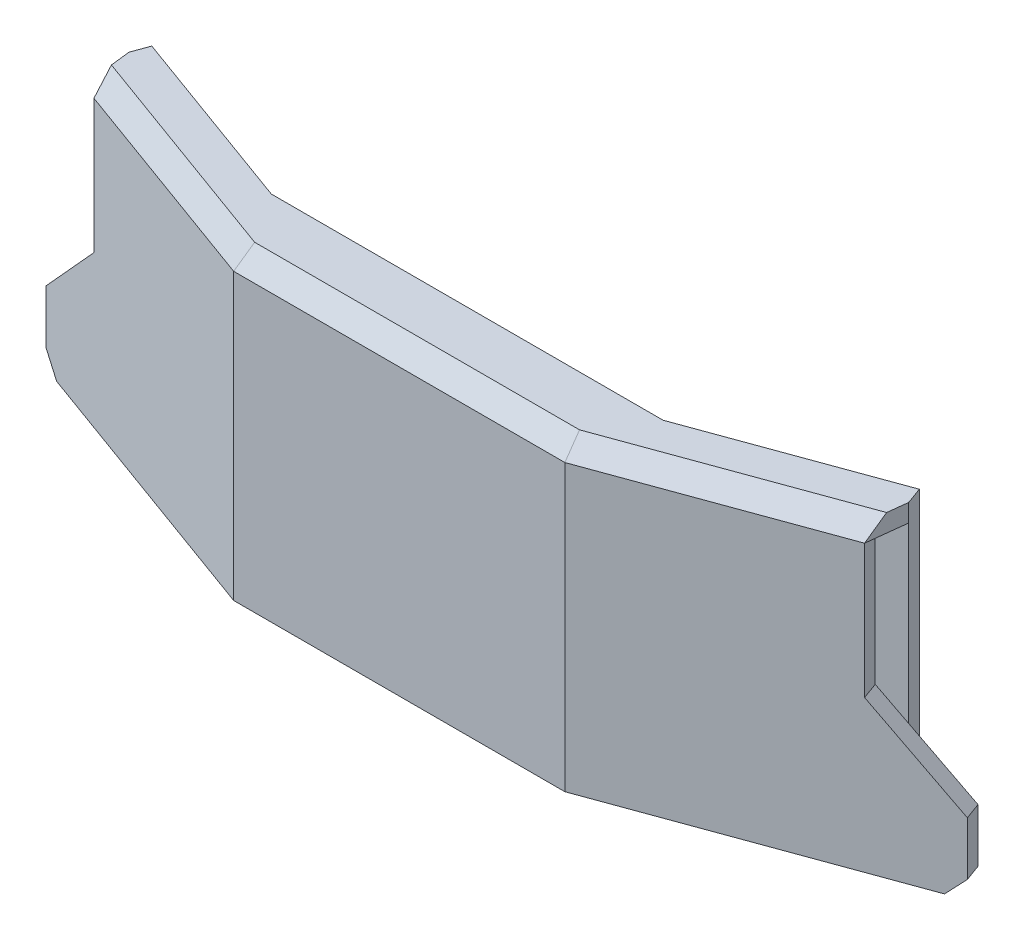
ISO-10303-21;
HEADER;
FILE_DESCRIPTION(('STEP AP214'),'2;1');
FILE_NAME('part.step','',(''),(''),'','','');
FILE_SCHEMA(('AUTOMOTIVE_DESIGN { 1 0 10303 214 1 1 1 1 }'));
ENDSEC;
DATA;
#1=APPLICATION_CONTEXT('core data for automotive mechanical design processes');
#2=APPLICATION_PROTOCOL_DEFINITION('international standard','automotive_design',2000,#1);
#3=PRODUCT_CONTEXT('',#1,'mechanical');
#4=PRODUCT('Part','Part','',(#3));
#5=PRODUCT_RELATED_PRODUCT_CATEGORY('part','',(#4));
#6=PRODUCT_DEFINITION_FORMATION('','',#4);
#7=PRODUCT_DEFINITION_CONTEXT('part definition',#1,'design');
#8=PRODUCT_DEFINITION('design','',#6,#7);
#9=PRODUCT_DEFINITION_SHAPE('','',#8);
#10=(LENGTH_UNIT() NAMED_UNIT(*) SI_UNIT(.MILLI.,.METRE.));
#11=(NAMED_UNIT(*) PLANE_ANGLE_UNIT() SI_UNIT($,.RADIAN.));
#12=(NAMED_UNIT(*) SI_UNIT($,.STERADIAN.) SOLID_ANGLE_UNIT());
#13=UNCERTAINTY_MEASURE_WITH_UNIT(LENGTH_MEASURE(1.E-05),#10,'distance_accuracy_value','');
#14=(GEOMETRIC_REPRESENTATION_CONTEXT(3) GLOBAL_UNCERTAINTY_ASSIGNED_CONTEXT((#13)) GLOBAL_UNIT_ASSIGNED_CONTEXT((#10,
#11,#12)) REPRESENTATION_CONTEXT('',''));
#15=CARTESIAN_POINT('',(0.,0.,0.));
#16=DIRECTION('',(0.,0.,1.));
#17=DIRECTION('',(1.,0.,0.));
#18=AXIS2_PLACEMENT_3D('',#15,#16,#17);
#19=CARTESIAN_POINT('',(0.,0.,0.));
#20=DIRECTION('',(0.,-1.,0.));
#21=DIRECTION('',(0.,0.,-1.));
#22=AXIS2_PLACEMENT_3D('',#19,#20,#21);
#23=PLANE('',#22);
#24=DIRECTION('',(0.939692620785973,0.,-0.342020143325491));
#25=VECTOR('',#24,1.);
#26=CARTESIAN_POINT('',(18.233058655028,0.,0.));
#27=LINE('',#26,#25);
#28=CARTESIAN_POINT('',(37.4365744717796,0.,-6.98950815055367));
#29=VERTEX_POINT('',#28);
#30=CARTESIAN_POINT('',(40.6840402866537,0.,-8.17148904396418));
#31=VERTEX_POINT('',#30);
#32=EDGE_CURVE('E306',#29,#31,#27,.T.);
#33=ORIENTED_EDGE('',*,*,#32,.F.);
#34=DIRECTION('',(0.,0.,1.));
#35=VECTOR('',#34,1.);
#36=CARTESIAN_POINT('',(37.4365744717795,0.,-11.2462192404578));
#37=LINE('',#36,#35);
#38=CARTESIAN_POINT('',(37.4365744717795,0.,-11.2462192404578));
#39=VERTEX_POINT('',#38);
#40=EDGE_CURVE('E408',#39,#29,#37,.T.);
#41=ORIENTED_EDGE('',*,*,#40,.F.);
#42=DIRECTION('',(-0.939692620785974,0.,0.342020143325488));
#43=VECTOR('',#42,1.);
#44=CARTESIAN_POINT('',(43.0747301964954,0.,-13.2983401004107));
#45=LINE('',#44,#43);
#46=CARTESIAN_POINT('',(43.0747301964954,0.,-13.2983401004107));
#47=VERTEX_POINT('',#46);
#48=EDGE_CURVE('E406',#47,#39,#45,.T.);
#49=ORIENTED_EDGE('',*,*,#48,.F.);
#50=DIRECTION('',(-0.342020143325483,0.,-0.939692620785976));
#51=VECTOR('',#50,1.);
#52=CARTESIAN_POINT('',(43.7587704831463,0.,-11.4189548588388));
#53=LINE('',#52,#51);
#54=CARTESIAN_POINT('',(43.7587704831463,0.,-11.4189548588388));
#55=VERTEX_POINT('',#54);
#56=EDGE_CURVE('E404',#55,#47,#53,.T.);
#57=ORIENTED_EDGE('',*,*,#56,.F.);
#58=DIRECTION('',(0.939692620785975,0.,-0.342020143325486));
#59=VECTOR('',#58,1.);
#60=CARTESIAN_POINT('',(40.0000000000024,0.,-10.0508742855368));
#61=LINE('',#60,#59);
#62=CARTESIAN_POINT('',(40.0000000000024,0.,-10.0508742855368));
#63=VERTEX_POINT('',#62);
#64=EDGE_CURVE('E402',#63,#55,#61,.T.);
#65=ORIENTED_EDGE('',*,*,#64,.F.);
#66=DIRECTION('',(-0.342020143325488,0.,-0.939692620785974));
#67=VECTOR('',#66,1.);
#68=CARTESIAN_POINT('',(40.0000000000024,0.,-10.0508742855368));
#69=LINE('',#68,#67);
#70=EDGE_CURVE('E400',#31,#63,#69,.T.);
#71=ORIENTED_EDGE('',*,*,#70,.F.);
#72=EDGE_LOOP('',(#33,#41,#49,#57,#65,#71));
#73=FACE_BOUND('',#72,.T.);
#74=ADVANCED_FACE('F46',(#73),#23,.T.);
#75=CARTESIAN_POINT('',(-40.0000000000015,30.,-10.0508742855391));
#76=DIRECTION('',(0.342020143325618,0.,-0.939692620785927));
#77=DIRECTION('',(-0.939692620785927,0.,-0.342020143325618));
#78=AXIS2_PLACEMENT_3D('',#75,#76,#77);
#79=PLANE('',#78);
#80=DIRECTION('',(0.939692620785927,0.,0.342020143325618));
#81=VECTOR('',#80,1.);
#82=CARTESIAN_POINT('',(-40.0000000000015,0.,-10.0508742855391));
#83=LINE('',#82,#81);
#84=CARTESIAN_POINT('',(-43.7587704831452,0.,-11.4189548588416));
#85=VERTEX_POINT('',#84);
#86=CARTESIAN_POINT('',(-40.0000000000015,0.,-10.0508742855391));
#87=VERTEX_POINT('',#86);
#88=EDGE_CURVE('E353',#85,#87,#83,.T.);
#89=ORIENTED_EDGE('',*,*,#88,.T.);
#90=DIRECTION('',(0.,-1.,0.));
#91=VECTOR('',#90,1.);
#92=CARTESIAN_POINT('',(-40.0000000000015,30.,-10.0508742855391));
#93=LINE('',#92,#91);
#94=CARTESIAN_POINT('',(-40.0000000000015,30.,-10.0508742855391));
#95=VERTEX_POINT('',#94);
#96=EDGE_CURVE('E307',#95,#87,#93,.T.);
#97=ORIENTED_EDGE('',*,*,#96,.F.);
#98=DIRECTION('',(0.939692620785927,0.,0.342020143325618));
#99=VECTOR('',#98,1.);
#100=CARTESIAN_POINT('',(-40.0000000000015,30.,-10.0508742855391));
#101=LINE('',#100,#99);
#102=CARTESIAN_POINT('',(-43.7587704831452,30.,-11.4189548588416));
#103=VERTEX_POINT('',#102);
#104=EDGE_CURVE('E354',#103,#95,#101,.T.);
#105=ORIENTED_EDGE('',*,*,#104,.F.);
#106=DIRECTION('',(0.,-1.,0.));
#107=VECTOR('',#106,1.);
#108=CARTESIAN_POINT('',(-43.7587704831452,30.,-11.4189548588416));
#109=LINE('',#108,#107);
#110=EDGE_CURVE('E394',#103,#85,#109,.T.);
#111=ORIENTED_EDGE('',*,*,#110,.T.);
#112=EDGE_LOOP('',(#89,#97,#105,#111));
#113=FACE_BOUND('',#112,.T.);
#114=ADVANCED_FACE('F562',(#113),#79,.F.);
#115=CARTESIAN_POINT('',(-40.0000000000015,30.,-10.0508742855391));
#116=DIRECTION('',(0.939692620785933,0.,0.342020143325602));
#117=DIRECTION('',(0.342020143325602,0.,-0.939692620785933));
#118=AXIS2_PLACEMENT_3D('',#115,#116,#117);
#119=PLANE('',#118);
#120=DIRECTION('',(-0.342020143325602,0.,0.939692620785933));
#121=VECTOR('',#120,1.);
#122=CARTESIAN_POINT('',(-40.0000000000015,0.,-10.0508742855391));
#123=LINE('',#122,#121);
#124=CARTESIAN_POINT('',(-40.6840402866527,0.,-8.17148904396725));
#125=VERTEX_POINT('',#124);
#126=EDGE_CURVE('E397',#87,#125,#123,.T.);
#127=ORIENTED_EDGE('',*,*,#126,.T.);
#128=DIRECTION('',(0.,-1.,0.));
#129=VECTOR('',#128,1.);
#130=CARTESIAN_POINT('',(-40.6840402866527,30.,-8.17148904396725));
#131=LINE('',#130,#129);
#132=CARTESIAN_POINT('',(-40.6840402866527,30.,-8.17148904396725));
#133=VERTEX_POINT('',#132);
#134=EDGE_CURVE('E466',#133,#125,#131,.T.);
#135=ORIENTED_EDGE('',*,*,#134,.F.);
#136=DIRECTION('',(-0.342020143325602,0.,0.939692620785933));
#137=VECTOR('',#136,1.);
#138=CARTESIAN_POINT('',(-40.0000000000015,30.,-10.0508742855391));
#139=LINE('',#138,#137);
#140=EDGE_CURVE('E357',#95,#133,#139,.T.);
#141=ORIENTED_EDGE('',*,*,#140,.F.);
#142=ORIENTED_EDGE('',*,*,#96,.T.);
#143=EDGE_LOOP('',(#127,#135,#141,#142));
#144=FACE_BOUND('',#143,.T.);
#145=ADVANCED_FACE('F560',(#144),#119,.F.);
#146=CARTESIAN_POINT('',(-42.5634255282245,30.,-8.85552933061848));
#147=DIRECTION('',(0.939692620785926,0.,0.342020143325619));
#148=DIRECTION('',(0.342020143325619,0.,-0.939692620785927));
#149=AXIS2_PLACEMENT_3D('',#146,#147,#148);
#150=PLANE('',#149);
#151=DIRECTION('',(0.,-1.,0.));
#152=VECTOR('',#151,1.);
#153=CARTESIAN_POINT('',(-42.5634255282245,30.,-8.85552933061848));
#154=LINE('',#153,#152);
#155=CARTESIAN_POINT('',(-42.5634255282245,30.,-8.85552933061848));
#156=VERTEX_POINT('',#155);
#157=CARTESIAN_POINT('',(-42.5634255282245,15.,-8.85552933061852));
#158=VERTEX_POINT('',#157);
#159=EDGE_CURVE('E463',#156,#158,#154,.T.);
#160=ORIENTED_EDGE('',*,*,#159,.T.);
#161=DIRECTION('',(-0.342020143325619,0.,0.939692620785927));
#162=VECTOR('',#161,1.);
#163=CARTESIAN_POINT('',(-35.638045454857,15.,-27.8828547033399));
#164=LINE('',#163,#162);
#165=CARTESIAN_POINT('',(-43.2474658148758,15.,-6.97614408904662));
#166=VERTEX_POINT('',#165);
#167=EDGE_CURVE('E282',#158,#166,#164,.T.);
#168=ORIENTED_EDGE('',*,*,#167,.T.);
#169=DIRECTION('',(0.,-1.,0.));
#170=VECTOR('',#169,1.);
#171=CARTESIAN_POINT('',(-43.2474658148758,30.,-6.97614408904662));
#172=LINE('',#171,#170);
#173=CARTESIAN_POINT('',(-43.2474658148758,30.,-6.97614408904662));
#174=VERTEX_POINT('',#173);
#175=EDGE_CURVE('E460',#174,#166,#172,.T.);
#176=ORIENTED_EDGE('',*,*,#175,.F.);
#177=DIRECTION('',(-0.342020143325619,0.,0.939692620785926));
#178=VECTOR('',#177,1.);
#179=CARTESIAN_POINT('',(-42.5634255282245,30.,-8.85552933061848));
#180=LINE('',#179,#178);
#181=EDGE_CURVE('E364',#156,#174,#180,.T.);
#182=ORIENTED_EDGE('',*,*,#181,.F.);
#183=EDGE_LOOP('',(#160,#168,#176,#182));
#184=FACE_BOUND('',#183,.T.);
#185=ADVANCED_FACE('F554',(#184),#150,.F.);
#186=CARTESIAN_POINT('',(-43.2474658148758,30.,-6.97614408904662));
#187=DIRECTION('',(0.342020143325619,0.,-0.939692620785927));
#188=DIRECTION('',(-0.939692620785927,0.,-0.342020143325619));
#189=AXIS2_PLACEMENT_3D('',#186,#187,#188);
#190=PLANE('',#189);
#191=DIRECTION('',(0.,-1.,0.));
#192=VECTOR('',#191,1.);
#193=CARTESIAN_POINT('',(-51.7046994019491,5.99999999999991,-10.0543253789772));
#194=LINE('',#193,#192);
#195=CARTESIAN_POINT('',(-51.7046994019491,5.99999999999991,-10.0543253789772));
#196=VERTEX_POINT('',#195);
#197=CARTESIAN_POINT('',(-51.7046994019492,0.,-10.0543253789772));
#198=VERTEX_POINT('',#197);
#199=EDGE_CURVE('E279',#196,#198,#194,.T.);
#200=ORIENTED_EDGE('',*,*,#199,.T.);
#201=DIRECTION('',(-0.664463024388691,0.707106781186544,-0.241844762647941));
#202=VECTOR('',#201,1.);
#203=CARTESIAN_POINT('',(-51.7046994019492,0.,-10.0543253789772));
#204=LINE('',#203,#202);
#205=CARTESIAN_POINT('',(-49.8253141603773,-2.,-9.37028509232598));
#206=VERTEX_POINT('',#205);
#207=EDGE_CURVE('E494',#198,#206,#204,.F.);
#208=ORIENTED_EDGE('',*,*,#207,.T.);
#209=DIRECTION('',(-0.939692620785927,0.,-0.342020143325619));
#210=VECTOR('',#209,1.);
#211=CARTESIAN_POINT('',(-18.5857126164448,-2.,2.00000000000009));
#212=LINE('',#211,#210);
#213=CARTESIAN_POINT('',(-18.5857126164448,-2.,2.00000000000009));
#214=VERTEX_POINT('',#213);
#215=EDGE_CURVE('E286',#214,#206,#212,.T.);
#216=ORIENTED_EDGE('',*,*,#215,.F.);
#217=DIRECTION('',(0.,-1.,0.));
#218=VECTOR('',#217,1.);
#219=CARTESIAN_POINT('',(-18.5857126164448,30.,2.00000000000009));
#220=LINE('',#219,#218);
#221=CARTESIAN_POINT('',(-18.5857126164448,30.,2.00000000000009));
#222=VERTEX_POINT('',#221);
#223=EDGE_CURVE('E458',#222,#214,#220,.T.);
#224=ORIENTED_EDGE('',*,*,#223,.F.);
#225=DIRECTION('',(-0.939692620785927,0.,-0.342020143325619));
#226=VECTOR('',#225,1.);
#227=CARTESIAN_POINT('',(-43.2474658148758,30.,-6.97614408904662));
#228=LINE('',#227,#226);
#229=EDGE_CURVE('E483',#222,#174,#228,.T.);
#230=ORIENTED_EDGE('',*,*,#229,.T.);
#231=ORIENTED_EDGE('',*,*,#175,.T.);
#232=DIRECTION('',(-0.664463024388684,-0.707106781186551,-0.241844762647939));
#233=VECTOR('',#232,1.);
#234=CARTESIAN_POINT('',(-43.2474658148758,15.,-6.97614408904662));
#235=LINE('',#234,#233);
#236=EDGE_CURVE('E270',#166,#196,#235,.T.);
#237=ORIENTED_EDGE('',*,*,#236,.T.);
#238=EDGE_LOOP('',(#200,#208,#216,#224,#230,#231,#237));
#239=FACE_BOUND('',#238,.T.);
#240=ADVANCED_FACE('F519',(#239),#190,.F.);
#241=CARTESIAN_POINT('',(-18.5857126164448,30.,2.00000000000009));
#242=DIRECTION('',(0.,0.,-1.));
#243=DIRECTION('',(-1.,0.,0.));
#244=AXIS2_PLACEMENT_3D('',#241,#242,#243);
#245=PLANE('',#244);
#246=DIRECTION('',(0.,-1.,0.));
#247=VECTOR('',#246,1.);
#248=CARTESIAN_POINT('',(18.5857126164443,30.,2.00000000000003));
#249=LINE('',#248,#247);
#250=CARTESIAN_POINT('',(18.5857126164443,30.,2.00000000000003));
#251=VERTEX_POINT('',#250);
#252=CARTESIAN_POINT('',(18.5857126164443,-2.,2.00000000000003));
#253=VERTEX_POINT('',#252);
#254=EDGE_CURVE('E455',#251,#253,#249,.T.);
#255=ORIENTED_EDGE('',*,*,#254,.F.);
#256=DIRECTION('',(-1.,0.,0.));
#257=VECTOR('',#256,1.);
#258=CARTESIAN_POINT('',(-18.5857126164448,30.,2.00000000000009));
#259=LINE('',#258,#257);
#260=EDGE_CURVE('E481',#251,#222,#259,.T.);
#261=ORIENTED_EDGE('',*,*,#260,.T.);
#262=ORIENTED_EDGE('',*,*,#223,.T.);
#263=DIRECTION('',(-1.,0.,0.));
#264=VECTOR('',#263,1.);
#265=CARTESIAN_POINT('',(18.5857126164443,-2.,2.00000000000003));
#266=LINE('',#265,#264);
#267=EDGE_CURVE('E300',#253,#214,#266,.T.);
#268=ORIENTED_EDGE('',*,*,#267,.F.);
#269=EDGE_LOOP('',(#255,#261,#262,#268));
#270=FACE_BOUND('',#269,.T.);
#271=ADVANCED_FACE('F526',(#270),#245,.F.);
#272=CARTESIAN_POINT('',(43.2474658148765,30.,-6.97614408904317));
#273=DIRECTION('',(-0.342020143325486,0.,-0.939692620785975));
#274=DIRECTION('',(-0.939692620785975,0.,0.342020143325486));
#275=AXIS2_PLACEMENT_3D('',#272,#273,#274);
#276=PLANE('',#275);
#277=DIRECTION('',(-0.939692620785975,0.,0.342020143325486));
#278=VECTOR('',#277,1.);
#279=CARTESIAN_POINT('',(43.2474658148765,-2.,-6.97614408904317));
#280=LINE('',#279,#278);
#281=CARTESIAN_POINT('',(49.8253141603785,-2.,-9.37028509232163));
#282=VERTEX_POINT('',#281);
#283=EDGE_CURVE('E298',#282,#253,#280,.T.);
#284=ORIENTED_EDGE('',*,*,#283,.F.);
#285=DIRECTION('',(-0.664463024388721,-0.707106781186548,0.241844762647846));
#286=VECTOR('',#285,1.);
#287=CARTESIAN_POINT('',(49.8253141603785,-2.,-9.37028509232163));
#288=LINE('',#287,#286);
#289=CARTESIAN_POINT('',(51.7046994019503,-1.22298005056365E-13,-10.0543253789726));
#290=VERTEX_POINT('',#289);
#291=EDGE_CURVE('E69',#282,#290,#288,.F.);
#292=ORIENTED_EDGE('',*,*,#291,.T.);
#293=DIRECTION('',(0.,1.,0.));
#294=VECTOR('',#293,1.);
#295=CARTESIAN_POINT('',(51.7046994019503,5.9999999999999,-10.0543253789726));
#296=LINE('',#295,#294);
#297=CARTESIAN_POINT('',(51.7046994019503,5.9999999999999,-10.0543253789726));
#298=VERTEX_POINT('',#297);
#299=EDGE_CURVE('E247',#290,#298,#296,.T.);
#300=ORIENTED_EDGE('',*,*,#299,.T.);
#301=DIRECTION('',(-0.664463024388719,0.707106781186551,0.241844762647845));
#302=VECTOR('',#301,1.);
#303=CARTESIAN_POINT('',(43.2474658148765,15.,-6.97614408904318));
#304=LINE('',#303,#302);
#305=CARTESIAN_POINT('',(43.2474658148765,15.,-6.97614408904318));
#306=VERTEX_POINT('',#305);
#307=EDGE_CURVE('E252',#298,#306,#304,.T.);
#308=ORIENTED_EDGE('',*,*,#307,.T.);
#309=DIRECTION('',(0.,-1.,0.));
#310=VECTOR('',#309,1.);
#311=CARTESIAN_POINT('',(43.2474658148765,30.,-6.97614408904317));
#312=LINE('',#311,#310);
#313=CARTESIAN_POINT('',(43.2474658148765,30.,-6.97614408904317));
#314=VERTEX_POINT('',#313);
#315=EDGE_CURVE('E453',#314,#306,#312,.T.);
#316=ORIENTED_EDGE('',*,*,#315,.F.);
#317=DIRECTION('',(-0.939692620785975,0.,0.342020143325486));
#318=VECTOR('',#317,1.);
#319=CARTESIAN_POINT('',(18.5857126164443,30.,2.00000000000003));
#320=LINE('',#319,#318);
#321=EDGE_CURVE('E479',#314,#251,#320,.T.);
#322=ORIENTED_EDGE('',*,*,#321,.T.);
#323=ORIENTED_EDGE('',*,*,#254,.T.);
#324=EDGE_LOOP('',(#284,#292,#300,#308,#316,#322,#323));
#325=FACE_BOUND('',#324,.T.);
#326=ADVANCED_FACE('F249',(#325),#276,.F.);
#327=CARTESIAN_POINT('',(42.5634255282255,30.,-8.85552933061514));
#328=DIRECTION('',(-0.939692620785975,0.,0.342020143325486));
#329=DIRECTION('',(0.342020143325486,0.,0.939692620785975));
#330=AXIS2_PLACEMENT_3D('',#327,#328,#329);
#331=PLANE('',#330);
#332=ORIENTED_EDGE('',*,*,#315,.T.);
#333=DIRECTION('',(0.342020143325486,0.,0.939692620785975));
#334=VECTOR('',#333,1.);
#335=CARTESIAN_POINT('',(35.6380454548608,15.,-27.8828547033374));
#336=LINE('',#335,#334);
#337=CARTESIAN_POINT('',(42.5634255282256,15.,-8.85552933061496));
#338=VERTEX_POINT('',#337);
#339=EDGE_CURVE('E260',#338,#306,#336,.T.);
#340=ORIENTED_EDGE('',*,*,#339,.F.);
#341=DIRECTION('',(0.,-1.,0.));
#342=VECTOR('',#341,1.);
#343=CARTESIAN_POINT('',(42.5634255282255,30.,-8.85552933061514));
#344=LINE('',#343,#342);
#345=CARTESIAN_POINT('',(42.5634255282255,30.,-8.85552933061514));
#346=VERTEX_POINT('',#345);
#347=EDGE_CURVE('E450',#346,#338,#344,.T.);
#348=ORIENTED_EDGE('',*,*,#347,.F.);
#349=DIRECTION('',(-0.342020143325486,0.,-0.939692620785975));
#350=VECTOR('',#349,1.);
#351=CARTESIAN_POINT('',(42.5634255282255,30.,-8.85552933061514));
#352=LINE('',#351,#350);
#353=EDGE_CURVE('E367',#314,#346,#352,.T.);
#354=ORIENTED_EDGE('',*,*,#353,.F.);
#355=EDGE_LOOP('',(#332,#340,#348,#354));
#356=FACE_BOUND('',#355,.T.);
#357=ADVANCED_FACE('F787',(#356),#331,.F.);
#358=CARTESIAN_POINT('',(40.0000000000024,30.,-10.0508742855368));
#359=DIRECTION('',(-0.939692620785974,0.,0.342020143325488));
#360=DIRECTION('',(0.342020143325488,0.,0.939692620785974));
#361=AXIS2_PLACEMENT_3D('',#358,#359,#360);
#362=PLANE('',#361);
#363=ORIENTED_EDGE('',*,*,#70,.T.);
#364=DIRECTION('',(0.,-1.,0.));
#365=VECTOR('',#364,1.);
#366=CARTESIAN_POINT('',(40.0000000000024,30.,-10.0508742855368));
#367=LINE('',#366,#365);
#368=CARTESIAN_POINT('',(40.0000000000024,30.,-10.0508742855368));
#369=VERTEX_POINT('',#368);
#370=EDGE_CURVE('E444',#369,#63,#367,.T.);
#371=ORIENTED_EDGE('',*,*,#370,.F.);
#372=DIRECTION('',(-0.342020143325488,0.,-0.939692620785974));
#373=VECTOR('',#372,1.);
#374=CARTESIAN_POINT('',(40.0000000000024,30.,-10.0508742855368));
#375=LINE('',#374,#373);
#376=CARTESIAN_POINT('',(40.6840402866537,30.,-8.17148904396418));
#377=VERTEX_POINT('',#376);
#378=EDGE_CURVE('E373',#377,#369,#375,.T.);
#379=ORIENTED_EDGE('',*,*,#378,.F.);
#380=DIRECTION('',(0.,-1.,0.));
#381=VECTOR('',#380,1.);
#382=CARTESIAN_POINT('',(40.6840402866537,30.,-8.17148904396418));
#383=LINE('',#382,#381);
#384=EDGE_CURVE('E447',#377,#31,#383,.T.);
#385=ORIENTED_EDGE('',*,*,#384,.T.);
#386=EDGE_LOOP('',(#363,#371,#379,#385));
#387=FACE_BOUND('',#386,.T.);
#388=ADVANCED_FACE('F621',(#387),#362,.F.);
#389=CARTESIAN_POINT('',(40.0000000000024,30.,-10.0508742855368));
#390=DIRECTION('',(-0.342020143325486,0.,-0.939692620785975));
#391=DIRECTION('',(-0.939692620785975,0.,0.342020143325486));
#392=AXIS2_PLACEMENT_3D('',#389,#390,#391);
#393=PLANE('',#392);
#394=ORIENTED_EDGE('',*,*,#64,.T.);
#395=DIRECTION('',(0.,-1.,0.));
#396=VECTOR('',#395,1.);
#397=CARTESIAN_POINT('',(43.7587704831463,30.,-11.4189548588388));
#398=LINE('',#397,#396);
#399=CARTESIAN_POINT('',(43.7587704831463,30.,-11.4189548588388));
#400=VERTEX_POINT('',#399);
#401=EDGE_CURVE('E441',#400,#55,#398,.T.);
#402=ORIENTED_EDGE('',*,*,#401,.F.);
#403=DIRECTION('',(0.939692620785975,0.,-0.342020143325486));
#404=VECTOR('',#403,1.);
#405=CARTESIAN_POINT('',(40.0000000000024,30.,-10.0508742855368));
#406=LINE('',#405,#404);
#407=EDGE_CURVE('E376',#369,#400,#406,.T.);
#408=ORIENTED_EDGE('',*,*,#407,.F.);
#409=ORIENTED_EDGE('',*,*,#370,.T.);
#410=EDGE_LOOP('',(#394,#402,#408,#409));
#411=FACE_BOUND('',#410,.T.);
#412=ADVANCED_FACE('F625',(#411),#393,.F.);
#413=CARTESIAN_POINT('',(43.7587704831463,30.,-11.4189548588388));
#414=DIRECTION('',(-0.939692620785976,0.,0.342020143325482));
#415=DIRECTION('',(0.342020143325483,0.,0.939692620785976));
#416=AXIS2_PLACEMENT_3D('',#413,#414,#415);
#417=PLANE('',#416);
#418=ORIENTED_EDGE('',*,*,#56,.T.);
#419=DIRECTION('',(0.,-1.,0.));
#420=VECTOR('',#419,1.);
#421=CARTESIAN_POINT('',(43.0747301964954,30.,-13.2983401004107));
#422=LINE('',#421,#420);
#423=CARTESIAN_POINT('',(43.0747301964954,32.,-13.2983401004107));
#424=VERTEX_POINT('',#423);
#425=EDGE_CURVE('E438',#424,#47,#422,.T.);
#426=ORIENTED_EDGE('',*,*,#425,.F.);
#427=DIRECTION('',(-0.342020143325483,0.,-0.939692620785976));
#428=VECTOR('',#427,1.);
#429=CARTESIAN_POINT('',(43.7587704831463,32.,-11.4189548588388));
#430=LINE('',#429,#428);
#431=CARTESIAN_POINT('',(43.7587704831463,32.,-11.4189548588388));
#432=VERTEX_POINT('',#431);
#433=EDGE_CURVE('E319',#432,#424,#430,.T.);
#434=ORIENTED_EDGE('',*,*,#433,.F.);
#435=DIRECTION('',(0.,-1.,0.));
#436=VECTOR('',#435,1.);
#437=CARTESIAN_POINT('',(43.7587704831463,32.,-11.4189548588388));
#438=LINE('',#437,#436);
#439=EDGE_CURVE('E347',#432,#400,#438,.T.);
#440=ORIENTED_EDGE('',*,*,#439,.T.);
#441=ORIENTED_EDGE('',*,*,#401,.T.);
#442=EDGE_LOOP('',(#418,#426,#434,#440,#441));
#443=FACE_BOUND('',#442,.T.);
#444=ADVANCED_FACE('F627',(#443),#417,.F.);
#445=CARTESIAN_POINT('',(43.0747301964954,30.,-13.2983401004107));
#446=DIRECTION('',(0.342020143325488,0.,0.939692620785974));
#447=DIRECTION('',(0.939692620785974,0.,-0.342020143325488));
#448=AXIS2_PLACEMENT_3D('',#445,#446,#447);
#449=PLANE('',#448);
#450=ORIENTED_EDGE('',*,*,#48,.T.);
#451=DIRECTION('',(0.,-1.,0.));
#452=VECTOR('',#451,1.);
#453=CARTESIAN_POINT('',(37.4365744717795,30.,-11.2462192404578));
#454=LINE('',#453,#452);
#455=CARTESIAN_POINT('',(37.4365744717795,30.,-11.2462192404578));
#456=VERTEX_POINT('',#455);
#457=EDGE_CURVE('E435',#456,#39,#454,.T.);
#458=ORIENTED_EDGE('',*,*,#457,.F.);
#459=DIRECTION('',(-0.939692620785974,0.,0.342020143325487));
#460=VECTOR('',#459,1.);
#461=CARTESIAN_POINT('',(37.4365744717795,30.,-11.2462192404578));
#462=LINE('',#461,#460);
#463=CARTESIAN_POINT('',(21.9872077630833,30.,-5.62310962023252));
#464=VERTEX_POINT('',#463);
#465=EDGE_CURVE('E335',#456,#464,#462,.T.);
#466=ORIENTED_EDGE('',*,*,#465,.T.);
#467=DIRECTION('',(0.,-1.,0.));
#468=VECTOR('',#467,1.);
#469=CARTESIAN_POINT('',(21.9872077630833,32.,-5.62310962023252));
#470=LINE('',#469,#468);
#471=CARTESIAN_POINT('',(21.9872077630833,32.,-5.62310962023252));
#472=VERTEX_POINT('',#471);
#473=EDGE_CURVE('E344',#472,#464,#470,.T.);
#474=ORIENTED_EDGE('',*,*,#473,.F.);
#475=DIRECTION('',(-0.939692620785974,0.,0.342020143325488));
#476=VECTOR('',#475,1.);
#477=CARTESIAN_POINT('',(43.0747301964954,32.,-13.2983401004107));
#478=LINE('',#477,#476);
#479=EDGE_CURVE('E322',#424,#472,#478,.T.);
#480=ORIENTED_EDGE('',*,*,#479,.F.);
#481=ORIENTED_EDGE('',*,*,#425,.T.);
#482=EDGE_LOOP('',(#450,#458,#466,#474,#480,#481));
#483=FACE_BOUND('',#482,.T.);
#484=ADVANCED_FACE('F600',(#483),#449,.F.);
#485=CARTESIAN_POINT('',(37.4365744717795,30.,-11.2462192404578));
#486=DIRECTION('',(1.,0.,0.));
#487=DIRECTION('',(0.,0.,-1.));
#488=AXIS2_PLACEMENT_3D('',#485,#486,#487);
#489=PLANE('',#488);
#490=ORIENTED_EDGE('',*,*,#40,.T.);
#491=DIRECTION('',(0.,-1.,0.));
#492=VECTOR('',#491,1.);
#493=CARTESIAN_POINT('',(37.4365744717795,30.,-6.98950815055351));
#494=LINE('',#493,#492);
#495=CARTESIAN_POINT('',(37.4365744717795,30.,-6.98950815055351));
#496=VERTEX_POINT('',#495);
#497=EDGE_CURVE('E432',#496,#29,#494,.T.);
#498=ORIENTED_EDGE('',*,*,#497,.F.);
#499=DIRECTION('',(0.,0.,1.));
#500=VECTOR('',#499,1.);
#501=CARTESIAN_POINT('',(37.4365744717795,30.,-11.2462192404578));
#502=LINE('',#501,#500);
#503=EDGE_CURVE('E379',#456,#496,#502,.T.);
#504=ORIENTED_EDGE('',*,*,#503,.F.);
#505=ORIENTED_EDGE('',*,*,#457,.T.);
#506=EDGE_LOOP('',(#490,#498,#504,#505));
#507=FACE_BOUND('',#506,.T.);
#508=ADVANCED_FACE('F614',(#507),#489,.F.);
#509=CARTESIAN_POINT('',(18.233058655028,30.,0.));
#510=DIRECTION('',(0.342020143325484,0.,0.939692620785976));
#511=DIRECTION('',(0.939692620785976,0.,-0.342020143325484));
#512=AXIS2_PLACEMENT_3D('',#509,#510,#511);
#513=PLANE('',#512);
#514=DIRECTION('',(0.,-1.,0.));
#515=VECTOR('',#514,1.);
#516=CARTESIAN_POINT('',(51.0206591152994,5.9999999999999,-11.9337106205443));
#517=LINE('',#516,#515);
#518=CARTESIAN_POINT('',(51.0206591152994,5.9999999999999,-11.9337106205443));
#519=VERTEX_POINT('',#518);
#520=CARTESIAN_POINT('',(51.0206591152994,-1.22298005056365E-13,-11.9337106205443));
#521=VERTEX_POINT('',#520);
#522=EDGE_CURVE('E258',#519,#521,#517,.T.);
#523=ORIENTED_EDGE('',*,*,#522,.T.);
#524=DIRECTION('',(0.664463024388722,0.707106781186548,-0.241844762647845));
#525=VECTOR('',#524,1.);
#526=CARTESIAN_POINT('',(49.1412738737276,-2.00000000000001,-11.2496703338934));
#527=LINE('',#526,#525);
#528=CARTESIAN_POINT('',(49.1412738737275,-2.,-11.2496703338936));
#529=VERTEX_POINT('',#528);
#530=EDGE_CURVE('E11',#521,#529,#527,.F.);
#531=ORIENTED_EDGE('',*,*,#530,.T.);
#532=DIRECTION('',(0.939692620785973,0.,-0.342020143325491));
#533=VECTOR('',#532,1.);
#534=CARTESIAN_POINT('',(18.233058655028,-2.,0.));
#535=LINE('',#534,#533);
#536=CARTESIAN_POINT('',(18.233058655028,-2.,0.));
#537=VERTEX_POINT('',#536);
#538=EDGE_CURVE('E295',#537,#529,#535,.T.);
#539=ORIENTED_EDGE('',*,*,#538,.F.);
#540=DIRECTION('',(0.,-1.,0.));
#541=VECTOR('',#540,1.);
#542=CARTESIAN_POINT('',(18.233058655028,30.,0.));
#543=LINE('',#542,#541);
#544=CARTESIAN_POINT('',(18.233058655028,30.,0.));
#545=VERTEX_POINT('',#544);
#546=EDGE_CURVE('E430',#545,#537,#543,.T.);
#547=ORIENTED_EDGE('',*,*,#546,.F.);
#548=DIRECTION('',(-0.939692620785975,0.,0.342020143325484));
#549=VECTOR('',#548,1.);
#550=CARTESIAN_POINT('',(18.233058655028,30.,0.));
#551=LINE('',#550,#549);
#552=EDGE_CURVE('E382',#496,#545,#551,.T.);
#553=ORIENTED_EDGE('',*,*,#552,.F.);
#554=ORIENTED_EDGE('',*,*,#497,.T.);
#555=ORIENTED_EDGE('',*,*,#32,.T.);
#556=ORIENTED_EDGE('',*,*,#384,.F.);
#557=DIRECTION('',(-0.939692620785973,0.,0.34202014332549));
#558=VECTOR('',#557,1.);
#559=CARTESIAN_POINT('',(40.6840402866537,30.,-8.17148904396418));
#560=LINE('',#559,#558);
#561=EDGE_CURVE('E370',#346,#377,#560,.T.);
#562=ORIENTED_EDGE('',*,*,#561,.F.);
#563=ORIENTED_EDGE('',*,*,#347,.T.);
#564=DIRECTION('',(0.664463024388719,-0.707106781186551,-0.241844762647844));
#565=VECTOR('',#564,1.);
#566=CARTESIAN_POINT('',(42.5634255282256,15.,-8.85552933061496));
#567=LINE('',#566,#565);
#568=EDGE_CURVE('E267',#338,#519,#567,.T.);
#569=ORIENTED_EDGE('',*,*,#568,.T.);
#570=EDGE_LOOP('',(#523,#531,#539,#547,#553,#554,#555,#556,#562,#563,#569));
#571=FACE_BOUND('',#570,.T.);
#572=ADVANCED_FACE('F583',(#571),#513,.F.);
#573=CARTESIAN_POINT('',(-18.233058655028,30.,0.));
#574=DIRECTION('',(0.,0.,1.));
#575=DIRECTION('',(1.,0.,0.));
#576=AXIS2_PLACEMENT_3D('',#573,#574,#575);
#577=PLANE('',#576);
#578=ORIENTED_EDGE('',*,*,#546,.T.);
#579=DIRECTION('',(1.,0.,0.));
#580=VECTOR('',#579,1.);
#581=CARTESIAN_POINT('',(-18.233058655028,-2.,0.));
#582=LINE('',#581,#580);
#583=CARTESIAN_POINT('',(-18.233058655028,-2.,0.));
#584=VERTEX_POINT('',#583);
#585=EDGE_CURVE('E292',#584,#537,#582,.T.);
#586=ORIENTED_EDGE('',*,*,#585,.F.);
#587=DIRECTION('',(0.,-1.,0.));
#588=VECTOR('',#587,1.);
#589=CARTESIAN_POINT('',(-18.233058655028,30.,0.));
#590=LINE('',#589,#588);
#591=CARTESIAN_POINT('',(-18.233058655028,30.,0.));
#592=VERTEX_POINT('',#591);
#593=EDGE_CURVE('E427',#592,#584,#590,.T.);
#594=ORIENTED_EDGE('',*,*,#593,.F.);
#595=DIRECTION('',(-1.,0.,0.));
#596=VECTOR('',#595,1.);
#597=CARTESIAN_POINT('',(-18.233058655028,30.,0.));
#598=LINE('',#597,#596);
#599=EDGE_CURVE('E385',#545,#592,#598,.T.);
#600=ORIENTED_EDGE('',*,*,#599,.F.);
#601=EDGE_LOOP('',(#578,#586,#594,#600));
#602=FACE_BOUND('',#601,.T.);
#603=ADVANCED_FACE('F579',(#602),#577,.F.);
#604=CARTESIAN_POINT('',(-37.4365744717784,30.,-6.98950815055621));
#605=DIRECTION('',(-0.342020143325619,0.,0.939692620785927));
#606=DIRECTION('',(0.939692620785927,0.,0.342020143325619));
#607=AXIS2_PLACEMENT_3D('',#604,#605,#606);
#608=PLANE('',#607);
#609=DIRECTION('',(0.939692620785927,0.,0.342020143325617));
#610=VECTOR('',#609,1.);
#611=CARTESIAN_POINT('',(-42.5634255282245,-2.,-8.85552933061848));
#612=LINE('',#611,#610);
#613=CARTESIAN_POINT('',(-49.1412738737261,-2.,-11.2496703338978));
#614=VERTEX_POINT('',#613);
#615=EDGE_CURVE('E289',#614,#584,#612,.T.);
#616=ORIENTED_EDGE('',*,*,#615,.F.);
#617=DIRECTION('',(0.664463024388691,-0.707106781186544,0.241844762647941));
#618=VECTOR('',#617,1.);
#619=CARTESIAN_POINT('',(-51.0206591152979,0.,-11.9337106205491));
#620=LINE('',#619,#618);
#621=CARTESIAN_POINT('',(-51.0206591152979,0.,-11.9337106205491));
#622=VERTEX_POINT('',#621);
#623=EDGE_CURVE('E501',#614,#622,#620,.F.);
#624=ORIENTED_EDGE('',*,*,#623,.T.);
#625=DIRECTION('',(0.,1.,0.));
#626=VECTOR('',#625,1.);
#627=CARTESIAN_POINT('',(-51.0206591152979,5.99999999999991,-11.9337106205491));
#628=LINE('',#627,#626);
#629=CARTESIAN_POINT('',(-51.0206591152979,5.99999999999991,-11.9337106205491));
#630=VERTEX_POINT('',#629);
#631=EDGE_CURVE('E273',#622,#630,#628,.T.);
#632=ORIENTED_EDGE('',*,*,#631,.T.);
#633=DIRECTION('',(0.664463024388685,0.707106781186551,0.241844762647939));
#634=VECTOR('',#633,1.);
#635=CARTESIAN_POINT('',(-42.5634255282245,15.,-8.85552933061851));
#636=LINE('',#635,#634);
#637=EDGE_CURVE('E271',#630,#158,#636,.T.);
#638=ORIENTED_EDGE('',*,*,#637,.T.);
#639=ORIENTED_EDGE('',*,*,#159,.F.);
#640=DIRECTION('',(-0.939692620785927,0.,-0.342020143325619));
#641=VECTOR('',#640,1.);
#642=CARTESIAN_POINT('',(-40.6840402866527,30.,-8.17148904396725));
#643=LINE('',#642,#641);
#644=EDGE_CURVE('E361',#133,#156,#643,.T.);
#645=ORIENTED_EDGE('',*,*,#644,.F.);
#646=ORIENTED_EDGE('',*,*,#134,.T.);
#647=DIRECTION('',(0.939692620785927,0.,0.342020143325617));
#648=VECTOR('',#647,1.);
#649=CARTESIAN_POINT('',(-42.5634255282245,0.,-8.85552933061848));
#650=LINE('',#649,#648);
#651=CARTESIAN_POINT('',(-37.4365744717784,0.,-6.98950815055621));
#652=VERTEX_POINT('',#651);
#653=EDGE_CURVE('E304',#125,#652,#650,.T.);
#654=ORIENTED_EDGE('',*,*,#653,.T.);
#655=DIRECTION('',(0.,-1.,0.));
#656=VECTOR('',#655,1.);
#657=CARTESIAN_POINT('',(-37.4365744717784,30.,-6.98950815055621));
#658=LINE('',#657,#656);
#659=CARTESIAN_POINT('',(-37.4365744717784,30.,-6.98950815055621));
#660=VERTEX_POINT('',#659);
#661=EDGE_CURVE('E424',#660,#652,#658,.T.);
#662=ORIENTED_EDGE('',*,*,#661,.F.);
#663=DIRECTION('',(-0.939692620785927,0.,-0.342020143325619));
#664=VECTOR('',#663,1.);
#665=CARTESIAN_POINT('',(-37.4365744717784,30.,-6.98950815055621));
#666=LINE('',#665,#664);
#667=EDGE_CURVE('E388',#592,#660,#666,.T.);
#668=ORIENTED_EDGE('',*,*,#667,.F.);
#669=ORIENTED_EDGE('',*,*,#593,.T.);
#670=EDGE_LOOP('',(#616,#624,#632,#638,#639,#645,#646,#654,#662,#668,#669));
#671=FACE_BOUND('',#670,.T.);
#672=ADVANCED_FACE('F507',(#671),#608,.F.);
#673=CARTESIAN_POINT('',(-37.4365744717784,30.,-11.2462192404597));
#674=DIRECTION('',(-1.,0.,0.));
#675=DIRECTION('',(0.,0.,1.));
#676=AXIS2_PLACEMENT_3D('',#673,#674,#675);
#677=PLANE('',#676);
#678=DIRECTION('',(0.,0.,-1.));
#679=VECTOR('',#678,1.);
#680=CARTESIAN_POINT('',(-37.4365744717784,0.,-11.2462192404597));
#681=LINE('',#680,#679);
#682=CARTESIAN_POINT('',(-37.4365744717784,0.,-11.2462192404597));
#683=VERTEX_POINT('',#682);
#684=EDGE_CURVE('E411',#652,#683,#681,.T.);
#685=ORIENTED_EDGE('',*,*,#684,.T.);
#686=DIRECTION('',(0.,-1.,0.));
#687=VECTOR('',#686,1.);
#688=CARTESIAN_POINT('',(-37.4365744717784,30.,-11.2462192404597));
#689=LINE('',#688,#687);
#690=CARTESIAN_POINT('',(-37.4365744717784,30.,-11.2462192404597));
#691=VERTEX_POINT('',#690);
#692=EDGE_CURVE('E421',#691,#683,#689,.T.);
#693=ORIENTED_EDGE('',*,*,#692,.F.);
#694=DIRECTION('',(0.,0.,-1.));
#695=VECTOR('',#694,1.);
#696=CARTESIAN_POINT('',(-37.4365744717784,30.,-11.2462192404597));
#697=LINE('',#696,#695);
#698=EDGE_CURVE('E391',#660,#691,#697,.T.);
#699=ORIENTED_EDGE('',*,*,#698,.F.);
#700=ORIENTED_EDGE('',*,*,#661,.T.);
#701=EDGE_LOOP('',(#685,#693,#699,#700));
#702=FACE_BOUND('',#701,.T.);
#703=ADVANCED_FACE('F572',(#702),#677,.F.);
#704=CARTESIAN_POINT('',(-43.074730196494,30.,-13.2983401004134));
#705=DIRECTION('',(-0.342020143325619,0.,0.939692620785927));
#706=DIRECTION('',(0.939692620785927,0.,0.342020143325619));
#707=AXIS2_PLACEMENT_3D('',#704,#705,#706);
#708=PLANE('',#707);
#709=DIRECTION('',(-0.939692620785927,0.,-0.342020143325619));
#710=VECTOR('',#709,1.);
#711=CARTESIAN_POINT('',(-43.074730196494,0.,-13.2983401004134));
#712=LINE('',#711,#710);
#713=CARTESIAN_POINT('',(-43.074730196494,0.,-13.2983401004134));
#714=VERTEX_POINT('',#713);
#715=EDGE_CURVE('E413',#683,#714,#712,.T.);
#716=ORIENTED_EDGE('',*,*,#715,.T.);
#717=DIRECTION('',(0.,-1.,0.));
#718=VECTOR('',#717,1.);
#719=CARTESIAN_POINT('',(-43.074730196494,30.,-13.2983401004134));
#720=LINE('',#719,#718);
#721=CARTESIAN_POINT('',(-43.074730196494,32.,-13.2983401004134));
#722=VERTEX_POINT('',#721);
#723=EDGE_CURVE('E418',#722,#714,#720,.T.);
#724=ORIENTED_EDGE('',*,*,#723,.F.);
#725=DIRECTION('',(-0.939692620785927,0.,-0.342020143325619));
#726=VECTOR('',#725,1.);
#727=CARTESIAN_POINT('',(-37.4365744717784,32.,-11.2462192404597));
#728=LINE('',#727,#726);
#729=CARTESIAN_POINT('',(-21.9872077630835,32.,-5.62310962023252));
#730=VERTEX_POINT('',#729);
#731=EDGE_CURVE('E326',#730,#722,#728,.T.);
#732=ORIENTED_EDGE('',*,*,#731,.F.);
#733=DIRECTION('',(0.,-1.,0.));
#734=VECTOR('',#733,1.);
#735=CARTESIAN_POINT('',(-21.9872077630835,32.,-5.62310962023252));
#736=LINE('',#735,#734);
#737=CARTESIAN_POINT('',(-21.9872077630835,30.,-5.62310962023252));
#738=VERTEX_POINT('',#737);
#739=EDGE_CURVE('E329',#730,#738,#736,.T.);
#740=ORIENTED_EDGE('',*,*,#739,.T.);
#741=DIRECTION('',(-0.939692620785927,0.,-0.342020143325619));
#742=VECTOR('',#741,1.);
#743=CARTESIAN_POINT('',(-43.074730196494,30.,-13.2983401004134));
#744=LINE('',#743,#742);
#745=EDGE_CURVE('E314',#738,#691,#744,.T.);
#746=ORIENTED_EDGE('',*,*,#745,.T.);
#747=ORIENTED_EDGE('',*,*,#692,.T.);
#748=EDGE_LOOP('',(#716,#724,#732,#740,#746,#747));
#749=FACE_BOUND('',#748,.T.);
#750=ADVANCED_FACE('F611',(#749),#708,.F.);
#751=CARTESIAN_POINT('',(-43.7587704831452,30.,-11.4189548588416));
#752=DIRECTION('',(0.939692620785927,0.,0.342020143325617));
#753=DIRECTION('',(0.342020143325617,0.,-0.939692620785927));
#754=AXIS2_PLACEMENT_3D('',#751,#752,#753);
#755=PLANE('',#754);
#756=DIRECTION('',(-0.342020143325617,0.,0.939692620785927));
#757=VECTOR('',#756,1.);
#758=CARTESIAN_POINT('',(-43.7587704831452,0.,-11.4189548588416));
#759=LINE('',#758,#757);
#760=EDGE_CURVE('E358',#714,#85,#759,.T.);
#761=ORIENTED_EDGE('',*,*,#760,.T.);
#762=ORIENTED_EDGE('',*,*,#110,.F.);
#763=DIRECTION('',(0.,-1.,0.));
#764=VECTOR('',#763,1.);
#765=CARTESIAN_POINT('',(-43.7587704831452,32.,-11.4189548588416));
#766=LINE('',#765,#764);
#767=CARTESIAN_POINT('',(-43.7587704831452,32.,-11.4189548588416));
#768=VERTEX_POINT('',#767);
#769=EDGE_CURVE('E350',#768,#103,#766,.T.);
#770=ORIENTED_EDGE('',*,*,#769,.F.);
#771=DIRECTION('',(-0.342020143325617,0.,0.939692620785927));
#772=VECTOR('',#771,1.);
#773=CARTESIAN_POINT('',(-43.074730196494,32.,-13.2983401004134));
#774=LINE('',#773,#772);
#775=EDGE_CURVE('E310',#722,#768,#774,.T.);
#776=ORIENTED_EDGE('',*,*,#775,.F.);
#777=ORIENTED_EDGE('',*,*,#723,.T.);
#778=EDGE_LOOP('',(#761,#762,#770,#776,#777));
#779=FACE_BOUND('',#778,.T.);
#780=ADVANCED_FACE('F610',(#779),#755,.F.);
#781=ORIENTED_EDGE('',*,*,#653,.F.);
#782=ORIENTED_EDGE('',*,*,#126,.F.);
#783=ORIENTED_EDGE('',*,*,#88,.F.);
#784=ORIENTED_EDGE('',*,*,#760,.F.);
#785=ORIENTED_EDGE('',*,*,#715,.F.);
#786=ORIENTED_EDGE('',*,*,#684,.F.);
#787=EDGE_LOOP('',(#781,#782,#783,#784,#785,#786));
#788=FACE_BOUND('',#787,.T.);
#789=ADVANCED_FACE('F566',(#788),#23,.T.);
#790=CARTESIAN_POINT('',(0.,30.,0.));
#791=DIRECTION('',(0.,1.,0.));
#792=DIRECTION('',(0.,0.,1.));
#793=AXIS2_PLACEMENT_3D('',#790,#791,#792);
#794=PLANE('',#793);
#795=DIRECTION('',(0.114331199546339,0.,0.993442689242965));
#796=VECTOR('',#795,1.);
#797=CARTESIAN_POINT('',(-43.7587704831452,30.,-11.4189548588416));
#798=LINE('',#797,#796);
#799=EDGE_CURVE('E303',#103,#174,#798,.T.);
#800=ORIENTED_EDGE('',*,*,#799,.F.);
#801=ORIENTED_EDGE('',*,*,#104,.T.);
#802=ORIENTED_EDGE('',*,*,#140,.T.);
#803=ORIENTED_EDGE('',*,*,#644,.T.);
#804=ORIENTED_EDGE('',*,*,#181,.T.);
#805=EDGE_LOOP('',(#800,#801,#802,#803,#804));
#806=FACE_BOUND('',#805,.T.);
#807=ADVANCED_FACE('F549',(#806),#794,.F.);
#808=DIRECTION('',(0.114331199546414,0.,-0.993442689242957));
#809=VECTOR('',#808,1.);
#810=CARTESIAN_POINT('',(43.2474658148765,30.,-6.97614408904317));
#811=LINE('',#810,#809);
#812=EDGE_CURVE('E332',#314,#400,#811,.T.);
#813=ORIENTED_EDGE('',*,*,#812,.F.);
#814=ORIENTED_EDGE('',*,*,#353,.T.);
#815=ORIENTED_EDGE('',*,*,#561,.T.);
#816=ORIENTED_EDGE('',*,*,#378,.T.);
#817=ORIENTED_EDGE('',*,*,#407,.T.);
#818=EDGE_LOOP('',(#813,#814,#815,#816,#817));
#819=FACE_BOUND('',#818,.T.);
#820=ADVANCED_FACE('F649',(#819),#794,.F.);
#821=ORIENTED_EDGE('',*,*,#465,.F.);
#822=ORIENTED_EDGE('',*,*,#503,.T.);
#823=ORIENTED_EDGE('',*,*,#552,.T.);
#824=ORIENTED_EDGE('',*,*,#599,.T.);
#825=ORIENTED_EDGE('',*,*,#667,.T.);
#826=ORIENTED_EDGE('',*,*,#698,.T.);
#827=ORIENTED_EDGE('',*,*,#745,.F.);
#828=DIRECTION('',(-1.,0.,0.));
#829=VECTOR('',#828,1.);
#830=CARTESIAN_POINT('',(21.9872077630833,30.,-5.62310962023252));
#831=LINE('',#830,#829);
#832=EDGE_CURVE('E337',#464,#738,#831,.T.);
#833=ORIENTED_EDGE('',*,*,#832,.F.);
#834=EDGE_LOOP('',(#821,#822,#823,#824,#825,#826,#827,#833));
#835=FACE_BOUND('',#834,.T.);
#836=ADVANCED_FACE('F575',(#835),#794,.F.);
#837=CARTESIAN_POINT('',(-43.7587704831452,32.,-11.4189548588416));
#838=DIRECTION('',(0.993442689242966,0.,-0.114331199546339));
#839=DIRECTION('',(-0.114331199546339,0.,-0.993442689242966));
#840=AXIS2_PLACEMENT_3D('',#837,#838,#839);
#841=PLANE('',#840);
#842=ORIENTED_EDGE('',*,*,#799,.T.);
#843=DIRECTION('',(-0.0852174447115686,0.666666666666668,-0.740468461632489));
#844=VECTOR('',#843,1.);
#845=CARTESIAN_POINT('',(-42.2525434473055,22.2165986010829,1.66890080113981));
#846=LINE('',#845,#844);
#847=CARTESIAN_POINT('',(-43.5031181490105,32.,-9.19754947394412));
#848=VERTEX_POINT('',#847);
#849=EDGE_CURVE('E485',#174,#848,#846,.T.);
#850=ORIENTED_EDGE('',*,*,#849,.T.);
#851=DIRECTION('',(0.114331199546339,0.,0.993442689242965));
#852=VECTOR('',#851,1.);
#853=CARTESIAN_POINT('',(-43.7587704831452,32.,-11.4189548588416));
#854=LINE('',#853,#852);
#855=EDGE_CURVE('E313',#768,#848,#854,.T.);
#856=ORIENTED_EDGE('',*,*,#855,.F.);
#857=ORIENTED_EDGE('',*,*,#769,.T.);
#858=EDGE_LOOP('',(#842,#850,#856,#857));
#859=FACE_BOUND('',#858,.T.);
#860=ADVANCED_FACE('F546',(#859),#841,.F.);
#861=CARTESIAN_POINT('',(43.2474658148765,32.,-6.97614408904317));
#862=DIRECTION('',(-0.993442689242957,0.,-0.114331199546414));
#863=DIRECTION('',(-0.114331199546414,0.,0.993442689242957));
#864=AXIS2_PLACEMENT_3D('',#861,#862,#863);
#865=PLANE('',#864);
#866=DIRECTION('',(0.114331199546414,0.,-0.993442689242957));
#867=VECTOR('',#866,1.);
#868=CARTESIAN_POINT('',(43.2474658148765,32.,-6.97614408904317));
#869=LINE('',#868,#867);
#870=CARTESIAN_POINT('',(43.5031181490114,32.,-9.19754947394058));
#871=VERTEX_POINT('',#870);
#872=EDGE_CURVE('E317',#871,#432,#869,.T.);
#873=ORIENTED_EDGE('',*,*,#872,.F.);
#874=DIRECTION('',(-0.0852174447116241,-0.666666666666679,0.740468461632473));
#875=VECTOR('',#874,1.);
#876=CARTESIAN_POINT('',(42.2525434473058,22.216598601084,1.66890080114168));
#877=LINE('',#876,#875);
#878=EDGE_CURVE('E477',#871,#314,#877,.T.);
#879=ORIENTED_EDGE('',*,*,#878,.T.);
#880=ORIENTED_EDGE('',*,*,#812,.T.);
#881=ORIENTED_EDGE('',*,*,#439,.F.);
#882=EDGE_LOOP('',(#873,#879,#880,#881));
#883=FACE_BOUND('',#882,.T.);
#884=ADVANCED_FACE('F592',(#883),#865,.F.);
#885=CARTESIAN_POINT('',(21.9872077630833,32.,-5.62310962023252));
#886=DIRECTION('',(0.,0.,1.));
#887=DIRECTION('',(1.,0.,0.));
#888=AXIS2_PLACEMENT_3D('',#885,#886,#887);
#889=PLANE('',#888);
#890=ORIENTED_EDGE('',*,*,#832,.T.);
#891=ORIENTED_EDGE('',*,*,#739,.F.);
#892=DIRECTION('',(-1.,0.,0.));
#893=VECTOR('',#892,1.);
#894=CARTESIAN_POINT('',(21.9872077630833,32.,-5.62310962023252));
#895=LINE('',#894,#893);
#896=EDGE_CURVE('E324',#472,#730,#895,.T.);
#897=ORIENTED_EDGE('',*,*,#896,.F.);
#898=ORIENTED_EDGE('',*,*,#473,.T.);
#899=EDGE_LOOP('',(#890,#891,#897,#898));
#900=FACE_BOUND('',#899,.T.);
#901=ADVANCED_FACE('F606',(#900),#889,.F.);
#902=CARTESIAN_POINT('',(0.,32.,0.));
#903=DIRECTION('',(0.,1.,0.));
#904=DIRECTION('',(0.,0.,1.));
#905=AXIS2_PLACEMENT_3D('',#902,#903,#904);
#906=PLANE('',#905);
#907=DIRECTION('',(1.,0.,0.));
#908=VECTOR('',#907,1.);
#909=CARTESIAN_POINT('',(18.5857126164443,32.,0.));
#910=LINE('',#909,#908);
#911=CARTESIAN_POINT('',(-18.2330586550279,32.,0.));
#912=VERTEX_POINT('',#911);
#913=CARTESIAN_POINT('',(18.2330586550276,32.,0.));
#914=VERTEX_POINT('',#913);
#915=EDGE_CURVE('E472',#912,#914,#910,.T.);
#916=ORIENTED_EDGE('',*,*,#915,.T.);
#917=DIRECTION('',(0.939692620785975,0.,-0.342020143325486));
#918=VECTOR('',#917,1.);
#919=CARTESIAN_POINT('',(42.5634255282255,32.,-8.85552933061514));
#920=LINE('',#919,#918);
#921=EDGE_CURVE('E474',#914,#871,#920,.T.);
#922=ORIENTED_EDGE('',*,*,#921,.T.);
#923=ORIENTED_EDGE('',*,*,#872,.T.);
#924=ORIENTED_EDGE('',*,*,#433,.T.);
#925=ORIENTED_EDGE('',*,*,#479,.T.);
#926=ORIENTED_EDGE('',*,*,#896,.T.);
#927=ORIENTED_EDGE('',*,*,#731,.T.);
#928=ORIENTED_EDGE('',*,*,#775,.T.);
#929=ORIENTED_EDGE('',*,*,#855,.T.);
#930=DIRECTION('',(0.939692620785927,0.,0.342020143325619));
#931=VECTOR('',#930,1.);
#932=CARTESIAN_POINT('',(-17.9016723297935,32.,0.120614758428222));
#933=LINE('',#932,#931);
#934=EDGE_CURVE('E309',#848,#912,#933,.T.);
#935=ORIENTED_EDGE('',*,*,#934,.T.);
#936=EDGE_LOOP('',(#916,#922,#923,#924,#925,#926,#927,#928,#929,#935));
#937=FACE_BOUND('',#936,.T.);
#938=ADVANCED_FACE('F541',(#937),#906,.T.);
#939=CARTESIAN_POINT('',(0.,-2.,0.));
#940=DIRECTION('',(0.,-1.,0.));
#941=DIRECTION('',(0.,0.,-1.));
#942=AXIS2_PLACEMENT_3D('',#939,#940,#941);
#943=PLANE('',#942);
#944=ORIENTED_EDGE('',*,*,#215,.T.);
#945=DIRECTION('',(0.342020143325619,0.,-0.939692620785927));
#946=VECTOR('',#945,1.);
#947=CARTESIAN_POINT('',(-47.008411178086,-2.,-17.1096624289671));
#948=LINE('',#947,#946);
#949=EDGE_CURVE('E499',#206,#614,#948,.T.);
#950=ORIENTED_EDGE('',*,*,#949,.T.);
#951=ORIENTED_EDGE('',*,*,#615,.T.);
#952=ORIENTED_EDGE('',*,*,#585,.T.);
#953=ORIENTED_EDGE('',*,*,#538,.T.);
#954=DIRECTION('',(0.342020143325486,0.,0.939692620785975));
#955=VECTOR('',#954,1.);
#956=CARTESIAN_POINT('',(47.0084111780891,-2.,-17.1096624289607));
#957=LINE('',#956,#955);
#958=EDGE_CURVE('E496',#529,#282,#957,.T.);
#959=ORIENTED_EDGE('',*,*,#958,.T.);
#960=ORIENTED_EDGE('',*,*,#283,.T.);
#961=ORIENTED_EDGE('',*,*,#267,.T.);
#962=EDGE_LOOP('',(#944,#950,#951,#952,#953,#959,#960,#961));
#963=FACE_BOUND('',#962,.T.);
#964=ADVANCED_FACE('F522',(#963),#943,.T.);
#965=CARTESIAN_POINT('',(-2.13286269564009,32.,5.85999209506925));
#966=DIRECTION('',(-0.241844762647941,0.707106781186545,0.66446302438869));
#967=DIRECTION('',(-0.939692620785927,0.,-0.342020143325619));
#968=AXIS2_PLACEMENT_3D('',#965,#966,#967);
#969=PLANE('',#968);
#970=ORIENTED_EDGE('',*,*,#849,.F.);
#971=ORIENTED_EDGE('',*,*,#229,.F.);
#972=DIRECTION('',(0.123724030206462,0.701673843159867,-0.701673843159864));
#973=VECTOR('',#972,1.);
#974=CARTESIAN_POINT('',(-18.4953315815114,30.5125763202561,1.48742367974397));
#975=LINE('',#974,#973);
#976=EDGE_CURVE('E290',#912,#222,#975,.F.);
#977=ORIENTED_EDGE('',*,*,#976,.F.);
#978=ORIENTED_EDGE('',*,*,#934,.F.);
#979=EDGE_LOOP('',(#970,#971,#977,#978));
#980=FACE_BOUND('',#979,.T.);
#981=ADVANCED_FACE('F533',(#980),#969,.T.);
#982=CARTESIAN_POINT('',(0.,32.,0.));
#983=DIRECTION('',(0.,0.707106781186546,0.707106781186549));
#984=DIRECTION('',(-1.,0.,0.));
#985=AXIS2_PLACEMENT_3D('',#982,#983,#984);
#986=PLANE('',#985);
#987=ORIENTED_EDGE('',*,*,#976,.T.);
#988=ORIENTED_EDGE('',*,*,#260,.F.);
#989=DIRECTION('',(-0.123724030206418,0.701673843159871,-0.701673843159867));
#990=VECTOR('',#989,1.);
#991=CARTESIAN_POINT('',(17.9539536363419,33.5828832182371,-1.58288321823708));
#992=LINE('',#991,#990);
#993=EDGE_CURVE('E276',#914,#251,#992,.F.);
#994=ORIENTED_EDGE('',*,*,#993,.F.);
#995=ORIENTED_EDGE('',*,*,#915,.F.);
#996=EDGE_LOOP('',(#987,#988,#994,#995));
#997=FACE_BOUND('',#996,.T.);
#998=ADVANCED_FACE('F537',(#997),#986,.T.);
#999=CARTESIAN_POINT('',(2.13286269563838,32.,5.85999209506711));
#1000=DIRECTION('',(0.241844762647846,0.707106781186546,0.664463024388723));
#1001=DIRECTION('',(-0.939692620785975,0.,0.342020143325486));
#1002=AXIS2_PLACEMENT_3D('',#999,#1000,#1001);
#1003=PLANE('',#1002);
#1004=ORIENTED_EDGE('',*,*,#993,.T.);
#1005=ORIENTED_EDGE('',*,*,#321,.F.);
#1006=ORIENTED_EDGE('',*,*,#878,.F.);
#1007=ORIENTED_EDGE('',*,*,#921,.F.);
#1008=EDGE_LOOP('',(#1004,#1005,#1006,#1007));
#1009=FACE_BOUND('',#1008,.T.);
#1010=ADVANCED_FACE('F590',(#1009),#1003,.T.);
#1011=CARTESIAN_POINT('',(-44.0952790419304,5.99999999999991,-30.9610359932704));
#1012=DIRECTION('',(-0.939692620785927,0.,-0.342020143325619));
#1013=DIRECTION('',(-0.342020143325619,0.,0.939692620785927));
#1014=AXIS2_PLACEMENT_3D('',#1011,#1012,#1013);
#1015=PLANE('',#1014);
#1016=ORIENTED_EDGE('',*,*,#631,.F.);
#1017=DIRECTION('',(-0.342020143325619,0.,0.939692620785927));
#1018=VECTOR('',#1017,1.);
#1019=CARTESIAN_POINT('',(-44.0952790419304,0.,-30.9610359932705));
#1020=LINE('',#1019,#1018);
#1021=EDGE_CURVE('E487',#622,#198,#1020,.T.);
#1022=ORIENTED_EDGE('',*,*,#1021,.T.);
#1023=ORIENTED_EDGE('',*,*,#199,.F.);
#1024=DIRECTION('',(-0.342020143325619,0.,0.939692620785927));
#1025=VECTOR('',#1024,1.);
#1026=CARTESIAN_POINT('',(-44.0952790419304,5.99999999999991,-30.9610359932704));
#1027=LINE('',#1026,#1025);
#1028=EDGE_CURVE('E274',#630,#196,#1027,.T.);
#1029=ORIENTED_EDGE('',*,*,#1028,.F.);
#1030=EDGE_LOOP('',(#1016,#1022,#1023,#1029));
#1031=FACE_BOUND('',#1030,.T.);
#1032=ADVANCED_FACE('F514',(#1031),#1015,.T.);
#1033=CARTESIAN_POINT('',(-35.638045454857,15.,-27.8828547033399));
#1034=DIRECTION('',(-0.664463024388691,0.707106781186544,-0.241844762647941));
#1035=DIRECTION('',(-0.728739444818673,-0.684791078771746,0.));
#1036=AXIS2_PLACEMENT_3D('',#1033,#1034,#1035);
#1037=PLANE('',#1036);
#1038=ORIENTED_EDGE('',*,*,#637,.F.);
#1039=ORIENTED_EDGE('',*,*,#1028,.T.);
#1040=ORIENTED_EDGE('',*,*,#236,.F.);
#1041=ORIENTED_EDGE('',*,*,#167,.F.);
#1042=EDGE_LOOP('',(#1038,#1039,#1040,#1041));
#1043=FACE_BOUND('',#1042,.T.);
#1044=ADVANCED_FACE('F557',(#1043),#1037,.T.);
#1045=CARTESIAN_POINT('',(35.6380454548608,15.,-27.8828547033374));
#1046=DIRECTION('',(0.664463024388725,0.707106781186544,-0.241844762647847));
#1047=DIRECTION('',(-0.728739444818655,0.684791078771765,0.));
#1048=AXIS2_PLACEMENT_3D('',#1045,#1046,#1047);
#1049=PLANE('',#1048);
#1050=ORIENTED_EDGE('',*,*,#568,.F.);
#1051=ORIENTED_EDGE('',*,*,#339,.T.);
#1052=ORIENTED_EDGE('',*,*,#307,.F.);
#1053=DIRECTION('',(0.342020143325486,0.,0.939692620785975));
#1054=VECTOR('',#1053,1.);
#1055=CARTESIAN_POINT('',(44.0952790419346,5.9999999999999,-30.9610359932667));
#1056=LINE('',#1055,#1054);
#1057=EDGE_CURVE('E256',#519,#298,#1056,.T.);
#1058=ORIENTED_EDGE('',*,*,#1057,.F.);
#1059=EDGE_LOOP('',(#1050,#1051,#1052,#1058));
#1060=FACE_BOUND('',#1059,.T.);
#1061=ADVANCED_FACE('F262',(#1060),#1049,.T.);
#1062=CARTESIAN_POINT('',(44.0952790419346,5.9999999999999,-30.9610359932667));
#1063=DIRECTION('',(0.939692620785975,0.,-0.342020143325486));
#1064=DIRECTION('',(-0.342020143325486,0.,-0.939692620785975));
#1065=AXIS2_PLACEMENT_3D('',#1062,#1063,#1064);
#1066=PLANE('',#1065);
#1067=ORIENTED_EDGE('',*,*,#299,.F.);
#1068=DIRECTION('',(-0.342020143325486,0.,-0.939692620785975));
#1069=VECTOR('',#1068,1.);
#1070=CARTESIAN_POINT('',(44.0952790419346,-1.22298005056365E-13,-30.9610359932667));
#1071=LINE('',#1070,#1069);
#1072=EDGE_CURVE('E55',#290,#521,#1071,.T.);
#1073=ORIENTED_EDGE('',*,*,#1072,.T.);
#1074=ORIENTED_EDGE('',*,*,#522,.F.);
#1075=ORIENTED_EDGE('',*,*,#1057,.T.);
#1076=EDGE_LOOP('',(#1067,#1073,#1074,#1075));
#1077=FACE_BOUND('',#1076,.T.);
#1078=ADVANCED_FACE('F257',(#1077),#1066,.T.);
#1079=CARTESIAN_POINT('',(-44.0952790419304,0.,-30.9610359932705));
#1080=DIRECTION('',(0.664463024388684,0.707106781186551,0.241844762647939));
#1081=DIRECTION('',(-0.342020143325619,0.,0.939692620785927));
#1082=AXIS2_PLACEMENT_3D('',#1079,#1080,#1081);
#1083=PLANE('',#1082);
#1084=ORIENTED_EDGE('',*,*,#623,.F.);
#1085=ORIENTED_EDGE('',*,*,#949,.F.);
#1086=ORIENTED_EDGE('',*,*,#207,.F.);
#1087=ORIENTED_EDGE('',*,*,#1021,.F.);
#1088=EDGE_LOOP('',(#1084,#1085,#1086,#1087));
#1089=FACE_BOUND('',#1088,.T.);
#1090=ADVANCED_FACE('F516',(#1089),#1083,.F.);
#1091=CARTESIAN_POINT('',(47.0084111780891,-2.,-17.1096624289607));
#1092=DIRECTION('',(-0.664463024388722,0.707106781186547,0.241844762647846));
#1093=DIRECTION('',(0.342020143325486,0.,0.939692620785975));
#1094=AXIS2_PLACEMENT_3D('',#1091,#1092,#1093);
#1095=PLANE('',#1094);
#1096=ORIENTED_EDGE('',*,*,#530,.F.);
#1097=ORIENTED_EDGE('',*,*,#1072,.F.);
#1098=ORIENTED_EDGE('',*,*,#291,.F.);
#1099=ORIENTED_EDGE('',*,*,#958,.F.);
#1100=EDGE_LOOP('',(#1096,#1097,#1098,#1099));
#1101=FACE_BOUND('',#1100,.T.);
#1102=ADVANCED_FACE('F49',(#1101),#1095,.F.);
#1103=CLOSED_SHELL('',(#74,#114,#145,#185,#240,#271,#326,#357,#388,#412,#444,#484,#508,#572,
#603,#672,#703,#750,#780,#789,#807,#820,#836,#860,#884,#901,#938,#964,#981,#998,#1010,#1032,
#1044,#1061,#1078,#1090,#1102));
#1104=MANIFOLD_SOLID_BREP('B2',#1103);
#1105=ADVANCED_BREP_SHAPE_REPRESENTATION('',(#18,#1104),#14);
#1106=SHAPE_DEFINITION_REPRESENTATION(#9,#1105);
ENDSEC;
END-ISO-10303-21;
